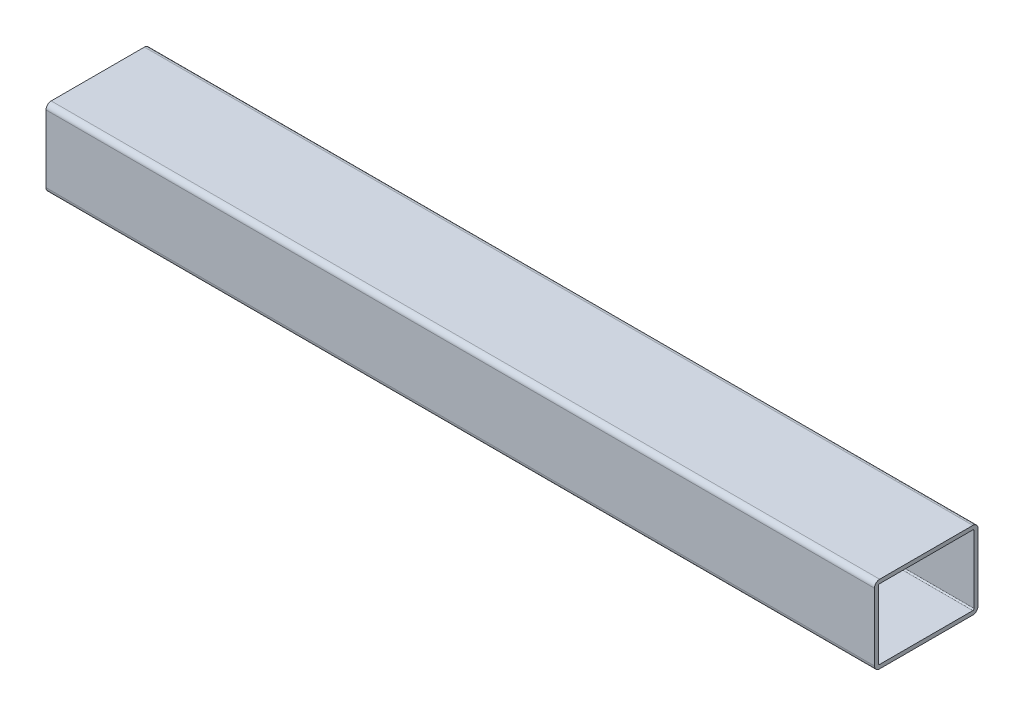
ISO-10303-21;
HEADER;
FILE_DESCRIPTION(('STEP AP214'),'2;1');
FILE_NAME('part.step','',(''),(''),'','','');
FILE_SCHEMA(('AUTOMOTIVE_DESIGN { 1 0 10303 214 1 1 1 1 }'));
ENDSEC;
DATA;
#1=APPLICATION_CONTEXT('core data for automotive mechanical design processes');
#2=APPLICATION_PROTOCOL_DEFINITION('international standard','automotive_design',2000,#1);
#3=PRODUCT_CONTEXT('',#1,'mechanical');
#4=PRODUCT('Part','Part','',(#3));
#5=PRODUCT_RELATED_PRODUCT_CATEGORY('part','',(#4));
#6=PRODUCT_DEFINITION_FORMATION('','',#4);
#7=PRODUCT_DEFINITION_CONTEXT('part definition',#1,'design');
#8=PRODUCT_DEFINITION('design','',#6,#7);
#9=PRODUCT_DEFINITION_SHAPE('','',#8);
#10=(LENGTH_UNIT() NAMED_UNIT(*) SI_UNIT(.MILLI.,.METRE.));
#11=(NAMED_UNIT(*) PLANE_ANGLE_UNIT() SI_UNIT($,.RADIAN.));
#12=(NAMED_UNIT(*) SI_UNIT($,.STERADIAN.) SOLID_ANGLE_UNIT());
#13=UNCERTAINTY_MEASURE_WITH_UNIT(LENGTH_MEASURE(1.E-05),#10,'distance_accuracy_value','');
#14=(GEOMETRIC_REPRESENTATION_CONTEXT(3) GLOBAL_UNCERTAINTY_ASSIGNED_CONTEXT((#13)) GLOBAL_UNIT_ASSIGNED_CONTEXT((#10,
#11,#12)) REPRESENTATION_CONTEXT('',''));
#15=CARTESIAN_POINT('',(0.,0.,0.));
#16=DIRECTION('',(0.,0.,1.));
#17=DIRECTION('',(1.,0.,0.));
#18=AXIS2_PLACEMENT_3D('',#15,#16,#17);
#19=CARTESIAN_POINT('',(0.,13.,18.5));
#20=DIRECTION('',(1.,0.,0.));
#21=DIRECTION('',(0.,-1.,0.));
#22=AXIS2_PLACEMENT_3D('',#19,#20,#21);
#23=PLANE('',#22);
#24=DIRECTION('',(0.,-1.,0.));
#25=VECTOR('',#24,1.);
#26=CARTESIAN_POINT('',(0.,13.,18.5));
#27=LINE('',#26,#25);
#28=CARTESIAN_POINT('',(0.,13.,18.5));
#29=VERTEX_POINT('',#28);
#30=CARTESIAN_POINT('',(0.,-13.,18.5));
#31=VERTEX_POINT('',#30);
#32=EDGE_CURVE('E326',#29,#31,#27,.T.);
#33=ORIENTED_EDGE('',*,*,#32,.T.);
#34=CARTESIAN_POINT('',(0.,-13.,18.));
#35=DIRECTION('',(1.,0.,0.));
#36=DIRECTION('',(0.,0.,-1.));
#37=AXIS2_PLACEMENT_3D('',#34,#35,#36);
#38=CIRCLE('',#37,0.5);
#39=CARTESIAN_POINT('',(0.,-13.5,18.));
#40=VERTEX_POINT('',#39);
#41=EDGE_CURVE('E163',#31,#40,#38,.T.);
#42=ORIENTED_EDGE('',*,*,#41,.T.);
#43=DIRECTION('',(0.,0.,-1.));
#44=VECTOR('',#43,1.);
#45=CARTESIAN_POINT('',(0.,-13.5,18.));
#46=LINE('',#45,#44);
#47=CARTESIAN_POINT('',(0.,-13.5,-18.));
#48=VERTEX_POINT('',#47);
#49=EDGE_CURVE('E92',#40,#48,#46,.T.);
#50=ORIENTED_EDGE('',*,*,#49,.T.);
#51=CARTESIAN_POINT('',(0.,-13.,-18.));
#52=DIRECTION('',(1.,0.,0.));
#53=DIRECTION('',(0.,0.,-1.));
#54=AXIS2_PLACEMENT_3D('',#51,#52,#53);
#55=CIRCLE('',#54,0.5);
#56=CARTESIAN_POINT('',(0.,-13.,-18.5));
#57=VERTEX_POINT('',#56);
#58=EDGE_CURVE('E216',#48,#57,#55,.T.);
#59=ORIENTED_EDGE('',*,*,#58,.T.);
#60=DIRECTION('',(0.,1.,0.));
#61=VECTOR('',#60,1.);
#62=CARTESIAN_POINT('',(0.,13.,-18.5));
#63=LINE('',#62,#61);
#64=CARTESIAN_POINT('',(0.,13.,-18.5));
#65=VERTEX_POINT('',#64);
#66=EDGE_CURVE('E220',#57,#65,#63,.T.);
#67=ORIENTED_EDGE('',*,*,#66,.T.);
#68=CARTESIAN_POINT('',(0.,13.,-18.));
#69=DIRECTION('',(1.,0.,0.));
#70=DIRECTION('',(0.,0.,-1.));
#71=AXIS2_PLACEMENT_3D('',#68,#69,#70);
#72=CIRCLE('',#71,0.5);
#73=CARTESIAN_POINT('',(0.,13.5,-18.));
#74=VERTEX_POINT('',#73);
#75=EDGE_CURVE('E349',#65,#74,#72,.T.);
#76=ORIENTED_EDGE('',*,*,#75,.T.);
#77=DIRECTION('',(0.,0.,1.));
#78=VECTOR('',#77,1.);
#79=CARTESIAN_POINT('',(0.,13.5,18.));
#80=LINE('',#79,#78);
#81=CARTESIAN_POINT('',(0.,13.5,18.));
#82=VERTEX_POINT('',#81);
#83=EDGE_CURVE('E341',#74,#82,#80,.T.);
#84=ORIENTED_EDGE('',*,*,#83,.T.);
#85=CARTESIAN_POINT('',(0.,13.,18.));
#86=DIRECTION('',(1.,0.,0.));
#87=DIRECTION('',(0.,0.,-1.));
#88=AXIS2_PLACEMENT_3D('',#85,#86,#87);
#89=CIRCLE('',#88,0.5);
#90=EDGE_CURVE('E333',#82,#29,#89,.T.);
#91=ORIENTED_EDGE('',*,*,#90,.T.);
#92=EDGE_LOOP('',(#33,#42,#50,#59,#67,#76,#84,#91));
#93=FACE_BOUND('',#92,.T.);
#94=DIRECTION('',(0.,1.,0.));
#95=VECTOR('',#94,1.);
#96=CARTESIAN_POINT('',(0.,13.,20.));
#97=LINE('',#96,#95);
#98=CARTESIAN_POINT('',(0.,13.,20.));
#99=VERTEX_POINT('',#98);
#100=CARTESIAN_POINT('',(0.,-13.,20.));
#101=VERTEX_POINT('',#100);
#102=EDGE_CURVE('E236',#99,#101,#97,.F.);
#103=ORIENTED_EDGE('',*,*,#102,.F.);
#104=CARTESIAN_POINT('',(0.,13.,18.));
#105=DIRECTION('',(-1.,0.,0.));
#106=DIRECTION('',(0.,0.,1.));
#107=AXIS2_PLACEMENT_3D('',#104,#105,#106);
#108=CIRCLE('',#107,2.);
#109=CARTESIAN_POINT('',(0.,15.,18.));
#110=VERTEX_POINT('',#109);
#111=EDGE_CURVE('E243',#110,#99,#108,.F.);
#112=ORIENTED_EDGE('',*,*,#111,.F.);
#113=DIRECTION('',(0.,0.,-1.));
#114=VECTOR('',#113,1.);
#115=CARTESIAN_POINT('',(0.,15.,18.));
#116=LINE('',#115,#114);
#117=CARTESIAN_POINT('',(0.,15.,-18.));
#118=VERTEX_POINT('',#117);
#119=EDGE_CURVE('E247',#118,#110,#116,.F.);
#120=ORIENTED_EDGE('',*,*,#119,.F.);
#121=CARTESIAN_POINT('',(0.,13.,-18.));
#122=DIRECTION('',(-1.,0.,0.));
#123=DIRECTION('',(0.,0.,1.));
#124=AXIS2_PLACEMENT_3D('',#121,#122,#123);
#125=CIRCLE('',#124,2.);
#126=CARTESIAN_POINT('',(0.,13.,-20.));
#127=VERTEX_POINT('',#126);
#128=EDGE_CURVE('E251',#127,#118,#125,.F.);
#129=ORIENTED_EDGE('',*,*,#128,.F.);
#130=DIRECTION('',(0.,-1.,0.));
#131=VECTOR('',#130,1.);
#132=CARTESIAN_POINT('',(0.,13.,-20.));
#133=LINE('',#132,#131);
#134=CARTESIAN_POINT('',(0.,-13.,-20.));
#135=VERTEX_POINT('',#134);
#136=EDGE_CURVE('E255',#135,#127,#133,.F.);
#137=ORIENTED_EDGE('',*,*,#136,.F.);
#138=CARTESIAN_POINT('',(0.,-13.,-18.));
#139=DIRECTION('',(-1.,0.,0.));
#140=DIRECTION('',(0.,0.,1.));
#141=AXIS2_PLACEMENT_3D('',#138,#139,#140);
#142=CIRCLE('',#141,2.);
#143=CARTESIAN_POINT('',(0.,-15.,-18.));
#144=VERTEX_POINT('',#143);
#145=EDGE_CURVE('E258',#144,#135,#142,.F.);
#146=ORIENTED_EDGE('',*,*,#145,.F.);
#147=DIRECTION('',(0.,0.,1.));
#148=VECTOR('',#147,1.);
#149=CARTESIAN_POINT('',(0.,-15.,18.));
#150=LINE('',#149,#148);
#151=CARTESIAN_POINT('',(0.,-15.,18.));
#152=VERTEX_POINT('',#151);
#153=EDGE_CURVE('E261',#152,#144,#150,.F.);
#154=ORIENTED_EDGE('',*,*,#153,.F.);
#155=CARTESIAN_POINT('',(0.,-13.,18.));
#156=DIRECTION('',(-1.,0.,0.));
#157=DIRECTION('',(0.,0.,1.));
#158=AXIS2_PLACEMENT_3D('',#155,#156,#157);
#159=CIRCLE('',#158,2.);
#160=EDGE_CURVE('E233',#101,#152,#159,.F.);
#161=ORIENTED_EDGE('',*,*,#160,.F.);
#162=EDGE_LOOP('',(#103,#112,#120,#129,#137,#146,#154,#161));
#163=FACE_BOUND('',#162,.T.);
#164=ADVANCED_FACE('F82',(#93,#163),#23,.F.);
#165=CARTESIAN_POINT('',(320.,-13.5,18.));
#166=DIRECTION('',(1.,0.,0.));
#167=DIRECTION('',(0.,0.,-1.));
#168=AXIS2_PLACEMENT_3D('',#165,#166,#167);
#169=PLANE('',#168);
#170=DIRECTION('',(0.,0.,-1.));
#171=VECTOR('',#170,1.);
#172=CARTESIAN_POINT('',(320.,-13.5,18.));
#173=LINE('',#172,#171);
#174=CARTESIAN_POINT('',(320.,-13.5,18.));
#175=VERTEX_POINT('',#174);
#176=CARTESIAN_POINT('',(320.,-13.5,-18.));
#177=VERTEX_POINT('',#176);
#178=EDGE_CURVE('E12',#175,#177,#173,.T.);
#179=ORIENTED_EDGE('',*,*,#178,.F.);
#180=CARTESIAN_POINT('',(320.,-13.,18.));
#181=DIRECTION('',(1.,0.,0.));
#182=DIRECTION('',(0.,0.,-1.));
#183=AXIS2_PLACEMENT_3D('',#180,#181,#182);
#184=CIRCLE('',#183,0.5);
#185=CARTESIAN_POINT('',(320.,-13.,18.5));
#186=VERTEX_POINT('',#185);
#187=EDGE_CURVE('E320',#186,#175,#184,.T.);
#188=ORIENTED_EDGE('',*,*,#187,.F.);
#189=DIRECTION('',(0.,-1.,0.));
#190=VECTOR('',#189,1.);
#191=CARTESIAN_POINT('',(320.,13.,18.5));
#192=LINE('',#191,#190);
#193=CARTESIAN_POINT('',(320.,13.,18.5));
#194=VERTEX_POINT('',#193);
#195=EDGE_CURVE('E331',#194,#186,#192,.T.);
#196=ORIENTED_EDGE('',*,*,#195,.F.);
#197=CARTESIAN_POINT('',(320.,13.,18.));
#198=DIRECTION('',(1.,0.,0.));
#199=DIRECTION('',(0.,0.,-1.));
#200=AXIS2_PLACEMENT_3D('',#197,#198,#199);
#201=CIRCLE('',#200,0.5);
#202=CARTESIAN_POINT('',(320.,13.5,18.));
#203=VERTEX_POINT('',#202);
#204=EDGE_CURVE('E339',#203,#194,#201,.T.);
#205=ORIENTED_EDGE('',*,*,#204,.F.);
#206=DIRECTION('',(0.,0.,1.));
#207=VECTOR('',#206,1.);
#208=CARTESIAN_POINT('',(320.,13.5,18.));
#209=LINE('',#208,#207);
#210=CARTESIAN_POINT('',(320.,13.5,-18.));
#211=VERTEX_POINT('',#210);
#212=EDGE_CURVE('E347',#211,#203,#209,.T.);
#213=ORIENTED_EDGE('',*,*,#212,.F.);
#214=CARTESIAN_POINT('',(320.,13.,-18.));
#215=DIRECTION('',(1.,0.,0.));
#216=DIRECTION('',(0.,0.,-1.));
#217=AXIS2_PLACEMENT_3D('',#214,#215,#216);
#218=CIRCLE('',#217,0.5);
#219=CARTESIAN_POINT('',(320.,13.,-18.5));
#220=VERTEX_POINT('',#219);
#221=EDGE_CURVE('E212',#220,#211,#218,.T.);
#222=ORIENTED_EDGE('',*,*,#221,.F.);
#223=DIRECTION('',(0.,1.,0.));
#224=VECTOR('',#223,1.);
#225=CARTESIAN_POINT('',(320.,13.,-18.5));
#226=LINE('',#225,#224);
#227=CARTESIAN_POINT('',(320.,-13.,-18.5));
#228=VERTEX_POINT('',#227);
#229=EDGE_CURVE('E209',#228,#220,#226,.T.);
#230=ORIENTED_EDGE('',*,*,#229,.F.);
#231=CARTESIAN_POINT('',(320.,-13.,-18.));
#232=DIRECTION('',(1.,0.,0.));
#233=DIRECTION('',(0.,0.,-1.));
#234=AXIS2_PLACEMENT_3D('',#231,#232,#233);
#235=CIRCLE('',#234,0.5);
#236=EDGE_CURVE('E101',#177,#228,#235,.T.);
#237=ORIENTED_EDGE('',*,*,#236,.F.);
#238=EDGE_LOOP('',(#179,#188,#196,#205,#213,#222,#230,#237));
#239=FACE_BOUND('',#238,.T.);
#240=DIRECTION('',(0.,0.,1.));
#241=VECTOR('',#240,1.);
#242=CARTESIAN_POINT('',(320.,-15.,18.));
#243=LINE('',#242,#241);
#244=CARTESIAN_POINT('',(320.,-15.,18.));
#245=VERTEX_POINT('',#244);
#246=CARTESIAN_POINT('',(320.,-15.,-18.));
#247=VERTEX_POINT('',#246);
#248=EDGE_CURVE('E86',#245,#247,#243,.F.);
#249=ORIENTED_EDGE('',*,*,#248,.T.);
#250=CARTESIAN_POINT('',(320.,-13.,-18.));
#251=DIRECTION('',(-1.,0.,0.));
#252=DIRECTION('',(0.,0.,1.));
#253=AXIS2_PLACEMENT_3D('',#250,#251,#252);
#254=CIRCLE('',#253,2.);
#255=CARTESIAN_POINT('',(320.,-13.,-20.));
#256=VERTEX_POINT('',#255);
#257=EDGE_CURVE('E257',#247,#256,#254,.F.);
#258=ORIENTED_EDGE('',*,*,#257,.T.);
#259=DIRECTION('',(0.,-1.,0.));
#260=VECTOR('',#259,1.);
#261=CARTESIAN_POINT('',(320.,13.,-20.));
#262=LINE('',#261,#260);
#263=CARTESIAN_POINT('',(320.,13.,-20.));
#264=VERTEX_POINT('',#263);
#265=EDGE_CURVE('E254',#256,#264,#262,.F.);
#266=ORIENTED_EDGE('',*,*,#265,.T.);
#267=CARTESIAN_POINT('',(320.,13.,-18.));
#268=DIRECTION('',(-1.,0.,0.));
#269=DIRECTION('',(0.,0.,1.));
#270=AXIS2_PLACEMENT_3D('',#267,#268,#269);
#271=CIRCLE('',#270,2.);
#272=CARTESIAN_POINT('',(320.,15.,-18.));
#273=VERTEX_POINT('',#272);
#274=EDGE_CURVE('E250',#264,#273,#271,.F.);
#275=ORIENTED_EDGE('',*,*,#274,.T.);
#276=DIRECTION('',(0.,0.,-1.));
#277=VECTOR('',#276,1.);
#278=CARTESIAN_POINT('',(320.,15.,18.));
#279=LINE('',#278,#277);
#280=CARTESIAN_POINT('',(320.,15.,18.));
#281=VERTEX_POINT('',#280);
#282=EDGE_CURVE('E246',#273,#281,#279,.F.);
#283=ORIENTED_EDGE('',*,*,#282,.T.);
#284=CARTESIAN_POINT('',(320.,13.,18.));
#285=DIRECTION('',(-1.,0.,0.));
#286=DIRECTION('',(0.,0.,1.));
#287=AXIS2_PLACEMENT_3D('',#284,#285,#286);
#288=CIRCLE('',#287,2.);
#289=CARTESIAN_POINT('',(320.,13.,20.));
#290=VERTEX_POINT('',#289);
#291=EDGE_CURVE('E242',#281,#290,#288,.F.);
#292=ORIENTED_EDGE('',*,*,#291,.T.);
#293=DIRECTION('',(0.,1.,0.));
#294=VECTOR('',#293,1.);
#295=CARTESIAN_POINT('',(320.,13.,20.));
#296=LINE('',#295,#294);
#297=CARTESIAN_POINT('',(320.,-13.,20.));
#298=VERTEX_POINT('',#297);
#299=EDGE_CURVE('E239',#290,#298,#296,.F.);
#300=ORIENTED_EDGE('',*,*,#299,.T.);
#301=CARTESIAN_POINT('',(320.,-13.,18.));
#302=DIRECTION('',(-1.,0.,0.));
#303=DIRECTION('',(0.,0.,1.));
#304=AXIS2_PLACEMENT_3D('',#301,#302,#303);
#305=CIRCLE('',#304,2.);
#306=EDGE_CURVE('E232',#298,#245,#305,.F.);
#307=ORIENTED_EDGE('',*,*,#306,.T.);
#308=EDGE_LOOP('',(#249,#258,#266,#275,#283,#292,#300,#307));
#309=FACE_BOUND('',#308,.T.);
#310=ADVANCED_FACE('F84',(#239,#309),#169,.T.);
#311=CARTESIAN_POINT('',(320.,-13.,18.));
#312=DIRECTION('',(-1.,0.,0.));
#313=DIRECTION('',(0.,0.,1.));
#314=AXIS2_PLACEMENT_3D('',#311,#312,#313);
#315=CYLINDRICAL_SURFACE('',#314,0.5);
#316=ORIENTED_EDGE('',*,*,#41,.F.);
#317=DIRECTION('',(-1.,0.,0.));
#318=VECTOR('',#317,1.);
#319=CARTESIAN_POINT('',(320.,-13.,18.5));
#320=LINE('',#319,#318);
#321=EDGE_CURVE('E315',#186,#31,#320,.T.);
#322=ORIENTED_EDGE('',*,*,#321,.F.);
#323=ORIENTED_EDGE('',*,*,#187,.T.);
#324=DIRECTION('',(-1.,0.,0.));
#325=VECTOR('',#324,1.);
#326=CARTESIAN_POINT('',(320.,-13.5,18.));
#327=LINE('',#326,#325);
#328=EDGE_CURVE('E324',#175,#40,#327,.T.);
#329=ORIENTED_EDGE('',*,*,#328,.T.);
#330=EDGE_LOOP('',(#316,#322,#323,#329));
#331=FACE_BOUND('',#330,.T.);
#332=ADVANCED_FACE('F367',(#331),#315,.F.);
#333=CARTESIAN_POINT('',(320.,13.,18.5));
#334=DIRECTION('',(0.,0.,-1.));
#335=DIRECTION('',(0.,1.,0.));
#336=AXIS2_PLACEMENT_3D('',#333,#334,#335);
#337=PLANE('',#336);
#338=ORIENTED_EDGE('',*,*,#32,.F.);
#339=DIRECTION('',(-1.,0.,0.));
#340=VECTOR('',#339,1.);
#341=CARTESIAN_POINT('',(320.,13.,18.5));
#342=LINE('',#341,#340);
#343=EDGE_CURVE('E328',#194,#29,#342,.T.);
#344=ORIENTED_EDGE('',*,*,#343,.F.);
#345=ORIENTED_EDGE('',*,*,#195,.T.);
#346=ORIENTED_EDGE('',*,*,#321,.T.);
#347=EDGE_LOOP('',(#338,#344,#345,#346));
#348=FACE_BOUND('',#347,.T.);
#349=ADVANCED_FACE('F369',(#348),#337,.T.);
#350=CARTESIAN_POINT('',(320.,13.,18.));
#351=DIRECTION('',(-1.,0.,0.));
#352=DIRECTION('',(0.,0.,1.));
#353=AXIS2_PLACEMENT_3D('',#350,#351,#352);
#354=CYLINDRICAL_SURFACE('',#353,0.5);
#355=ORIENTED_EDGE('',*,*,#90,.F.);
#356=DIRECTION('',(-1.,0.,0.));
#357=VECTOR('',#356,1.);
#358=CARTESIAN_POINT('',(320.,13.5,18.));
#359=LINE('',#358,#357);
#360=EDGE_CURVE('E336',#203,#82,#359,.T.);
#361=ORIENTED_EDGE('',*,*,#360,.F.);
#362=ORIENTED_EDGE('',*,*,#204,.T.);
#363=ORIENTED_EDGE('',*,*,#343,.T.);
#364=EDGE_LOOP('',(#355,#361,#362,#363));
#365=FACE_BOUND('',#364,.T.);
#366=ADVANCED_FACE('F371',(#365),#354,.F.);
#367=CARTESIAN_POINT('',(320.,13.5,18.));
#368=DIRECTION('',(0.,-1.,0.));
#369=DIRECTION('',(0.,0.,-1.));
#370=AXIS2_PLACEMENT_3D('',#367,#368,#369);
#371=PLANE('',#370);
#372=ORIENTED_EDGE('',*,*,#83,.F.);
#373=DIRECTION('',(-1.,0.,0.));
#374=VECTOR('',#373,1.);
#375=CARTESIAN_POINT('',(320.,13.5,-18.));
#376=LINE('',#375,#374);
#377=EDGE_CURVE('E344',#211,#74,#376,.T.);
#378=ORIENTED_EDGE('',*,*,#377,.F.);
#379=ORIENTED_EDGE('',*,*,#212,.T.);
#380=ORIENTED_EDGE('',*,*,#360,.T.);
#381=EDGE_LOOP('',(#372,#378,#379,#380));
#382=FACE_BOUND('',#381,.T.);
#383=ADVANCED_FACE('F360',(#382),#371,.T.);
#384=CARTESIAN_POINT('',(320.,13.,-18.));
#385=DIRECTION('',(-1.,0.,0.));
#386=DIRECTION('',(0.,0.,1.));
#387=AXIS2_PLACEMENT_3D('',#384,#385,#386);
#388=CYLINDRICAL_SURFACE('',#387,0.5);
#389=ORIENTED_EDGE('',*,*,#75,.F.);
#390=DIRECTION('',(-1.,0.,0.));
#391=VECTOR('',#390,1.);
#392=CARTESIAN_POINT('',(320.,13.,-18.5));
#393=LINE('',#392,#391);
#394=EDGE_CURVE('E352',#220,#65,#393,.T.);
#395=ORIENTED_EDGE('',*,*,#394,.F.);
#396=ORIENTED_EDGE('',*,*,#221,.T.);
#397=ORIENTED_EDGE('',*,*,#377,.T.);
#398=EDGE_LOOP('',(#389,#395,#396,#397));
#399=FACE_BOUND('',#398,.T.);
#400=ADVANCED_FACE('F354',(#399),#388,.F.);
#401=CARTESIAN_POINT('',(320.,13.,-18.5));
#402=DIRECTION('',(0.,0.,1.));
#403=DIRECTION('',(0.,-1.,0.));
#404=AXIS2_PLACEMENT_3D('',#401,#402,#403);
#405=PLANE('',#404);
#406=ORIENTED_EDGE('',*,*,#66,.F.);
#407=DIRECTION('',(-1.,0.,0.));
#408=VECTOR('',#407,1.);
#409=CARTESIAN_POINT('',(320.,-13.,-18.5));
#410=LINE('',#409,#408);
#411=EDGE_CURVE('E204',#228,#57,#410,.T.);
#412=ORIENTED_EDGE('',*,*,#411,.F.);
#413=ORIENTED_EDGE('',*,*,#229,.T.);
#414=ORIENTED_EDGE('',*,*,#394,.T.);
#415=EDGE_LOOP('',(#406,#412,#413,#414));
#416=FACE_BOUND('',#415,.T.);
#417=ADVANCED_FACE('F218',(#416),#405,.T.);
#418=CARTESIAN_POINT('',(320.,-13.,-18.));
#419=DIRECTION('',(-1.,0.,0.));
#420=DIRECTION('',(0.,0.,1.));
#421=AXIS2_PLACEMENT_3D('',#418,#419,#420);
#422=CYLINDRICAL_SURFACE('',#421,0.5);
#423=ORIENTED_EDGE('',*,*,#58,.F.);
#424=DIRECTION('',(-1.,0.,0.));
#425=VECTOR('',#424,1.);
#426=CARTESIAN_POINT('',(320.,-13.5,-18.));
#427=LINE('',#426,#425);
#428=EDGE_CURVE('E206',#177,#48,#427,.T.);
#429=ORIENTED_EDGE('',*,*,#428,.F.);
#430=ORIENTED_EDGE('',*,*,#236,.T.);
#431=ORIENTED_EDGE('',*,*,#411,.T.);
#432=EDGE_LOOP('',(#423,#429,#430,#431));
#433=FACE_BOUND('',#432,.T.);
#434=ADVANCED_FACE('F202',(#433),#422,.F.);
#435=CARTESIAN_POINT('',(320.,-13.5,18.));
#436=DIRECTION('',(0.,1.,0.));
#437=DIRECTION('',(0.,0.,1.));
#438=AXIS2_PLACEMENT_3D('',#435,#436,#437);
#439=PLANE('',#438);
#440=ORIENTED_EDGE('',*,*,#49,.F.);
#441=ORIENTED_EDGE('',*,*,#328,.F.);
#442=ORIENTED_EDGE('',*,*,#178,.T.);
#443=ORIENTED_EDGE('',*,*,#428,.T.);
#444=EDGE_LOOP('',(#440,#441,#442,#443));
#445=FACE_BOUND('',#444,.T.);
#446=ADVANCED_FACE('F364',(#445),#439,.T.);
#447=CARTESIAN_POINT('',(320.,-13.,18.));
#448=DIRECTION('',(-1.,0.,0.));
#449=DIRECTION('',(0.,0.,1.));
#450=AXIS2_PLACEMENT_3D('',#447,#448,#449);
#451=CYLINDRICAL_SURFACE('',#450,2.);
#452=ORIENTED_EDGE('',*,*,#160,.T.);
#453=DIRECTION('',(-1.,0.,0.));
#454=VECTOR('',#453,1.);
#455=CARTESIAN_POINT('',(320.,-15.,18.));
#456=LINE('',#455,#454);
#457=EDGE_CURVE('E234',#245,#152,#456,.T.);
#458=ORIENTED_EDGE('',*,*,#457,.F.);
#459=ORIENTED_EDGE('',*,*,#306,.F.);
#460=DIRECTION('',(1.,0.,0.));
#461=VECTOR('',#460,1.);
#462=CARTESIAN_POINT('',(320.,-13.,20.));
#463=LINE('',#462,#461);
#464=EDGE_CURVE('E230',#298,#101,#463,.F.);
#465=ORIENTED_EDGE('',*,*,#464,.T.);
#466=EDGE_LOOP('',(#452,#458,#459,#465));
#467=FACE_BOUND('',#466,.T.);
#468=ADVANCED_FACE('F400',(#467),#451,.T.);
#469=CARTESIAN_POINT('',(320.,13.,20.));
#470=DIRECTION('',(0.,0.,-1.));
#471=DIRECTION('',(0.,1.,0.));
#472=AXIS2_PLACEMENT_3D('',#469,#470,#471);
#473=PLANE('',#472);
#474=ORIENTED_EDGE('',*,*,#102,.T.);
#475=ORIENTED_EDGE('',*,*,#464,.F.);
#476=ORIENTED_EDGE('',*,*,#299,.F.);
#477=DIRECTION('',(-1.,0.,0.));
#478=VECTOR('',#477,1.);
#479=CARTESIAN_POINT('',(320.,13.,20.));
#480=LINE('',#479,#478);
#481=EDGE_CURVE('E237',#290,#99,#480,.T.);
#482=ORIENTED_EDGE('',*,*,#481,.T.);
#483=EDGE_LOOP('',(#474,#475,#476,#482));
#484=FACE_BOUND('',#483,.T.);
#485=ADVANCED_FACE('F310',(#484),#473,.F.);
#486=CARTESIAN_POINT('',(320.,13.,18.));
#487=DIRECTION('',(-1.,0.,0.));
#488=DIRECTION('',(0.,0.,1.));
#489=AXIS2_PLACEMENT_3D('',#486,#487,#488);
#490=CYLINDRICAL_SURFACE('',#489,2.);
#491=ORIENTED_EDGE('',*,*,#111,.T.);
#492=ORIENTED_EDGE('',*,*,#481,.F.);
#493=ORIENTED_EDGE('',*,*,#291,.F.);
#494=DIRECTION('',(1.,0.,0.));
#495=VECTOR('',#494,1.);
#496=CARTESIAN_POINT('',(320.,15.,18.));
#497=LINE('',#496,#495);
#498=EDGE_CURVE('E240',#281,#110,#497,.F.);
#499=ORIENTED_EDGE('',*,*,#498,.T.);
#500=EDGE_LOOP('',(#491,#492,#493,#499));
#501=FACE_BOUND('',#500,.T.);
#502=ADVANCED_FACE('F306',(#501),#490,.T.);
#503=CARTESIAN_POINT('',(320.,15.,18.));
#504=DIRECTION('',(0.,-1.,0.));
#505=DIRECTION('',(0.,0.,-1.));
#506=AXIS2_PLACEMENT_3D('',#503,#504,#505);
#507=PLANE('',#506);
#508=ORIENTED_EDGE('',*,*,#119,.T.);
#509=ORIENTED_EDGE('',*,*,#498,.F.);
#510=ORIENTED_EDGE('',*,*,#282,.F.);
#511=DIRECTION('',(-1.,0.,0.));
#512=VECTOR('',#511,1.);
#513=CARTESIAN_POINT('',(320.,15.,-18.));
#514=LINE('',#513,#512);
#515=EDGE_CURVE('E244',#273,#118,#514,.T.);
#516=ORIENTED_EDGE('',*,*,#515,.T.);
#517=EDGE_LOOP('',(#508,#509,#510,#516));
#518=FACE_BOUND('',#517,.T.);
#519=ADVANCED_FACE('F302',(#518),#507,.F.);
#520=CARTESIAN_POINT('',(320.,13.,-18.));
#521=DIRECTION('',(-1.,0.,0.));
#522=DIRECTION('',(0.,0.,1.));
#523=AXIS2_PLACEMENT_3D('',#520,#521,#522);
#524=CYLINDRICAL_SURFACE('',#523,2.);
#525=ORIENTED_EDGE('',*,*,#128,.T.);
#526=ORIENTED_EDGE('',*,*,#515,.F.);
#527=ORIENTED_EDGE('',*,*,#274,.F.);
#528=DIRECTION('',(1.,0.,0.));
#529=VECTOR('',#528,1.);
#530=CARTESIAN_POINT('',(320.,13.,-20.));
#531=LINE('',#530,#529);
#532=EDGE_CURVE('E248',#264,#127,#531,.F.);
#533=ORIENTED_EDGE('',*,*,#532,.T.);
#534=EDGE_LOOP('',(#525,#526,#527,#533));
#535=FACE_BOUND('',#534,.T.);
#536=ADVANCED_FACE('F298',(#535),#524,.T.);
#537=CARTESIAN_POINT('',(320.,13.,-20.));
#538=DIRECTION('',(0.,0.,1.));
#539=DIRECTION('',(0.,-1.,0.));
#540=AXIS2_PLACEMENT_3D('',#537,#538,#539);
#541=PLANE('',#540);
#542=ORIENTED_EDGE('',*,*,#136,.T.);
#543=ORIENTED_EDGE('',*,*,#532,.F.);
#544=ORIENTED_EDGE('',*,*,#265,.F.);
#545=DIRECTION('',(-1.,0.,0.));
#546=VECTOR('',#545,1.);
#547=CARTESIAN_POINT('',(320.,-13.,-20.));
#548=LINE('',#547,#546);
#549=EDGE_CURVE('E252',#256,#135,#548,.T.);
#550=ORIENTED_EDGE('',*,*,#549,.T.);
#551=EDGE_LOOP('',(#542,#543,#544,#550));
#552=FACE_BOUND('',#551,.T.);
#553=ADVANCED_FACE('F294',(#552),#541,.F.);
#554=CARTESIAN_POINT('',(320.,-13.,-18.));
#555=DIRECTION('',(-1.,0.,0.));
#556=DIRECTION('',(0.,0.,1.));
#557=AXIS2_PLACEMENT_3D('',#554,#555,#556);
#558=CYLINDRICAL_SURFACE('',#557,2.);
#559=ORIENTED_EDGE('',*,*,#145,.T.);
#560=ORIENTED_EDGE('',*,*,#549,.F.);
#561=ORIENTED_EDGE('',*,*,#257,.F.);
#562=DIRECTION('',(1.,0.,0.));
#563=VECTOR('',#562,1.);
#564=CARTESIAN_POINT('',(320.,-15.,-18.));
#565=LINE('',#564,#563);
#566=EDGE_CURVE('E154',#247,#144,#565,.F.);
#567=ORIENTED_EDGE('',*,*,#566,.T.);
#568=EDGE_LOOP('',(#559,#560,#561,#567));
#569=FACE_BOUND('',#568,.T.);
#570=ADVANCED_FACE('F290',(#569),#558,.T.);
#571=CARTESIAN_POINT('',(320.,-15.,18.));
#572=DIRECTION('',(0.,1.,0.));
#573=DIRECTION('',(0.,0.,1.));
#574=AXIS2_PLACEMENT_3D('',#571,#572,#573);
#575=PLANE('',#574);
#576=ORIENTED_EDGE('',*,*,#153,.T.);
#577=ORIENTED_EDGE('',*,*,#566,.F.);
#578=ORIENTED_EDGE('',*,*,#248,.F.);
#579=ORIENTED_EDGE('',*,*,#457,.T.);
#580=EDGE_LOOP('',(#576,#577,#578,#579));
#581=FACE_BOUND('',#580,.T.);
#582=ADVANCED_FACE('F314',(#581),#575,.F.);
#583=CLOSED_SHELL('',(#164,#310,#332,#349,#366,#383,#400,#417,#434,#446,#468,#485,#502,#519,
#536,#553,#570,#582));
#584=MANIFOLD_SOLID_BREP('B2',#583);
#585=ADVANCED_BREP_SHAPE_REPRESENTATION('',(#18,#584),#14);
#586=SHAPE_DEFINITION_REPRESENTATION(#9,#585);
ENDSEC;
END-ISO-10303-21;
